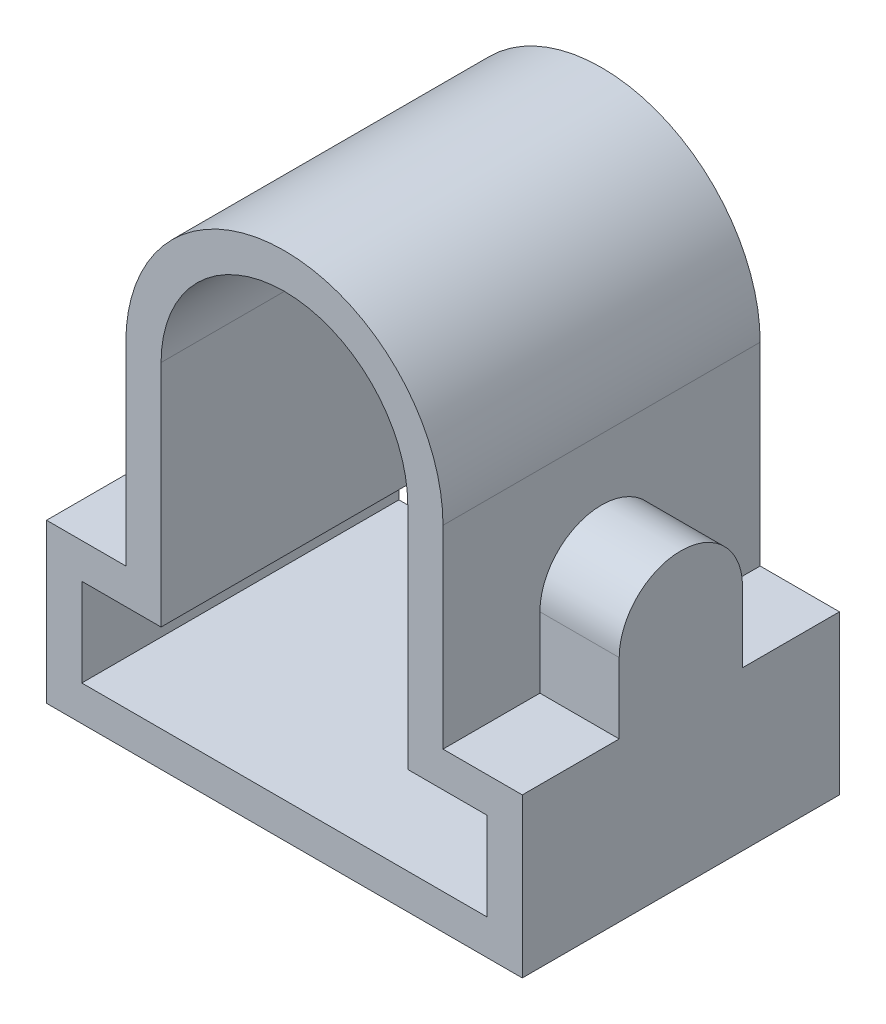
ISO-10303-21;
HEADER;
FILE_DESCRIPTION(('STEP AP214'),'2;1');
FILE_NAME('part.step','',(''),(''),'','','');
FILE_SCHEMA(('AUTOMOTIVE_DESIGN { 1 0 10303 214 1 1 1 1 }'));
ENDSEC;
DATA;
#1=APPLICATION_CONTEXT('core data for automotive mechanical design processes');
#2=APPLICATION_PROTOCOL_DEFINITION('international standard','automotive_design',2000,#1);
#3=PRODUCT_CONTEXT('',#1,'mechanical');
#4=PRODUCT('Part','Part','',(#3));
#5=PRODUCT_RELATED_PRODUCT_CATEGORY('part','',(#4));
#6=PRODUCT_DEFINITION_FORMATION('','',#4);
#7=PRODUCT_DEFINITION_CONTEXT('part definition',#1,'design');
#8=PRODUCT_DEFINITION('design','',#6,#7);
#9=PRODUCT_DEFINITION_SHAPE('','',#8);
#10=(LENGTH_UNIT() NAMED_UNIT(*) SI_UNIT(.MILLI.,.METRE.));
#11=(NAMED_UNIT(*) PLANE_ANGLE_UNIT() SI_UNIT($,.RADIAN.));
#12=(NAMED_UNIT(*) SI_UNIT($,.STERADIAN.) SOLID_ANGLE_UNIT());
#13=UNCERTAINTY_MEASURE_WITH_UNIT(LENGTH_MEASURE(1.E-05),#10,'distance_accuracy_value','');
#14=(GEOMETRIC_REPRESENTATION_CONTEXT(3) GLOBAL_UNCERTAINTY_ASSIGNED_CONTEXT((#13)) GLOBAL_UNIT_ASSIGNED_CONTEXT((#10,
#11,#12)) REPRESENTATION_CONTEXT('',''));
#15=CARTESIAN_POINT('',(0.,0.,0.));
#16=DIRECTION('',(0.,0.,1.));
#17=DIRECTION('',(1.,0.,0.));
#18=AXIS2_PLACEMENT_3D('',#15,#16,#17);
#19=CARTESIAN_POINT('',(67.5,45.,-45.));
#20=DIRECTION('',(0.,1.,0.));
#21=DIRECTION('',(0.,0.,1.));
#22=AXIS2_PLACEMENT_3D('',#19,#20,#21);
#23=PLANE('',#22);
#24=DIRECTION('',(0.,0.,1.));
#25=VECTOR('',#24,1.);
#26=CARTESIAN_POINT('',(67.5,45.,-45.));
#27=LINE('',#26,#25);
#28=CARTESIAN_POINT('',(67.5,45.,17.5));
#29=VERTEX_POINT('',#28);
#30=CARTESIAN_POINT('',(67.5,45.,45.));
#31=VERTEX_POINT('',#30);
#32=EDGE_CURVE('E318',#29,#31,#27,.T.);
#33=ORIENTED_EDGE('',*,*,#32,.F.);
#34=DIRECTION('',(-1.,0.,0.));
#35=VECTOR('',#34,1.);
#36=CARTESIAN_POINT('',(67.5,45.,17.5));
#37=LINE('',#36,#35);
#38=CARTESIAN_POINT('',(45.,45.,17.5));
#39=VERTEX_POINT('',#38);
#40=EDGE_CURVE('E190',#29,#39,#37,.T.);
#41=ORIENTED_EDGE('',*,*,#40,.T.);
#42=DIRECTION('',(0.,0.,1.));
#43=VECTOR('',#42,1.);
#44=CARTESIAN_POINT('',(45.,45.,-45.));
#45=LINE('',#44,#43);
#46=CARTESIAN_POINT('',(45.,45.,45.));
#47=VERTEX_POINT('',#46);
#48=EDGE_CURVE('E49',#39,#47,#45,.T.);
#49=ORIENTED_EDGE('',*,*,#48,.T.);
#50=DIRECTION('',(-1.,0.,0.));
#51=VECTOR('',#50,1.);
#52=CARTESIAN_POINT('',(67.5,45.,45.));
#53=LINE('',#52,#51);
#54=EDGE_CURVE('E253',#31,#47,#53,.T.);
#55=ORIENTED_EDGE('',*,*,#54,.F.);
#56=EDGE_LOOP('',(#33,#41,#49,#55));
#57=FACE_BOUND('',#56,.T.);
#58=ADVANCED_FACE('F41',(#57),#23,.T.);
#59=CARTESIAN_POINT('',(45.,45.,-45.));
#60=DIRECTION('',(1.,0.,0.));
#61=DIRECTION('',(0.,1.,0.));
#62=AXIS2_PLACEMENT_3D('',#59,#60,#61);
#63=PLANE('',#62);
#64=DIRECTION('',(0.,1.,0.));
#65=VECTOR('',#64,1.);
#66=CARTESIAN_POINT('',(45.,65.,-17.5));
#67=LINE('',#66,#65);
#68=CARTESIAN_POINT('',(45.,45.,-17.5));
#69=VERTEX_POINT('',#68);
#70=CARTESIAN_POINT('',(45.,65.,-17.5));
#71=VERTEX_POINT('',#70);
#72=EDGE_CURVE('E193',#69,#71,#67,.T.);
#73=ORIENTED_EDGE('',*,*,#72,.F.);
#74=CARTESIAN_POINT('',(45.,45.,-45.));
#75=VERTEX_POINT('',#74);
#76=EDGE_CURVE('E11',#75,#69,#45,.T.);
#77=ORIENTED_EDGE('',*,*,#76,.F.);
#78=DIRECTION('',(0.,1.,0.));
#79=VECTOR('',#78,1.);
#80=CARTESIAN_POINT('',(45.,45.,-45.));
#81=LINE('',#80,#79);
#82=CARTESIAN_POINT('',(45.,100.,-45.));
#83=VERTEX_POINT('',#82);
#84=EDGE_CURVE('E278',#75,#83,#81,.T.);
#85=ORIENTED_EDGE('',*,*,#84,.T.);
#86=DIRECTION('',(0.,0.,1.));
#87=VECTOR('',#86,1.);
#88=CARTESIAN_POINT('',(45.,100.,-45.));
#89=LINE('',#88,#87);
#90=CARTESIAN_POINT('',(45.,100.,45.));
#91=VERTEX_POINT('',#90);
#92=EDGE_CURVE('E44',#83,#91,#89,.T.);
#93=ORIENTED_EDGE('',*,*,#92,.T.);
#94=DIRECTION('',(0.,1.,0.));
#95=VECTOR('',#94,1.);
#96=CARTESIAN_POINT('',(45.,45.,45.));
#97=LINE('',#96,#95);
#98=EDGE_CURVE('E229',#47,#91,#97,.T.);
#99=ORIENTED_EDGE('',*,*,#98,.F.);
#100=ORIENTED_EDGE('',*,*,#48,.F.);
#101=DIRECTION('',(0.,-1.,0.));
#102=VECTOR('',#101,1.);
#103=CARTESIAN_POINT('',(45.,65.,17.5));
#104=LINE('',#103,#102);
#105=CARTESIAN_POINT('',(45.,65.,17.5));
#106=VERTEX_POINT('',#105);
#107=EDGE_CURVE('E341',#106,#39,#104,.T.);
#108=ORIENTED_EDGE('',*,*,#107,.F.);
#109=CARTESIAN_POINT('',(45.,65.,0.));
#110=DIRECTION('',(1.,0.,0.));
#111=DIRECTION('',(0.,1.,0.));
#112=AXIS2_PLACEMENT_3D('',#109,#110,#111);
#113=CIRCLE('',#112,17.5);
#114=EDGE_CURVE('E197',#71,#106,#113,.T.);
#115=ORIENTED_EDGE('',*,*,#114,.F.);
#116=EDGE_LOOP('',(#73,#77,#85,#93,#99,#100,#108,#115));
#117=FACE_BOUND('',#116,.T.);
#118=ADVANCED_FACE('F43',(#117),#63,.T.);
#119=DIRECTION('',(-1.,0.,0.));
#120=VECTOR('',#119,1.);
#121=CARTESIAN_POINT('',(67.5,45.,-17.5));
#122=LINE('',#121,#120);
#123=CARTESIAN_POINT('',(67.5,45.,-17.5));
#124=VERTEX_POINT('',#123);
#125=EDGE_CURVE('E208',#124,#69,#122,.T.);
#126=ORIENTED_EDGE('',*,*,#125,.F.);
#127=CARTESIAN_POINT('',(67.5,45.,-45.));
#128=VERTEX_POINT('',#127);
#129=EDGE_CURVE('E316',#128,#124,#27,.T.);
#130=ORIENTED_EDGE('',*,*,#129,.F.);
#131=DIRECTION('',(-1.,0.,0.));
#132=VECTOR('',#131,1.);
#133=CARTESIAN_POINT('',(67.5,45.,-45.));
#134=LINE('',#133,#132);
#135=EDGE_CURVE('E313',#128,#75,#134,.T.);
#136=ORIENTED_EDGE('',*,*,#135,.T.);
#137=ORIENTED_EDGE('',*,*,#76,.T.);
#138=EDGE_LOOP('',(#126,#130,#136,#137));
#139=FACE_BOUND('',#138,.T.);
#140=ADVANCED_FACE('F351',(#139),#23,.T.);
#141=CARTESIAN_POINT('',(67.5,0.,-45.));
#142=DIRECTION('',(1.,0.,0.));
#143=DIRECTION('',(0.,0.,-1.));
#144=AXIS2_PLACEMENT_3D('',#141,#142,#143);
#145=PLANE('',#144);
#146=ORIENTED_EDGE('',*,*,#129,.T.);
#147=DIRECTION('',(0.,1.,0.));
#148=VECTOR('',#147,1.);
#149=CARTESIAN_POINT('',(67.5,65.,-17.5));
#150=LINE('',#149,#148);
#151=CARTESIAN_POINT('',(67.5,65.,-17.5));
#152=VERTEX_POINT('',#151);
#153=EDGE_CURVE('E189',#124,#152,#150,.T.);
#154=ORIENTED_EDGE('',*,*,#153,.T.);
#155=CARTESIAN_POINT('',(67.5,65.,0.));
#156=DIRECTION('',(1.,0.,0.));
#157=DIRECTION('',(0.,1.,0.));
#158=AXIS2_PLACEMENT_3D('',#155,#156,#157);
#159=CIRCLE('',#158,17.5);
#160=CARTESIAN_POINT('',(67.5,65.,17.5));
#161=VERTEX_POINT('',#160);
#162=EDGE_CURVE('E192',#152,#161,#159,.T.);
#163=ORIENTED_EDGE('',*,*,#162,.T.);
#164=DIRECTION('',(0.,-1.,0.));
#165=VECTOR('',#164,1.);
#166=CARTESIAN_POINT('',(67.5,65.,17.5));
#167=LINE('',#166,#165);
#168=EDGE_CURVE('E181',#161,#29,#167,.T.);
#169=ORIENTED_EDGE('',*,*,#168,.T.);
#170=ORIENTED_EDGE('',*,*,#32,.T.);
#171=DIRECTION('',(0.,1.,0.));
#172=VECTOR('',#171,1.);
#173=CARTESIAN_POINT('',(67.5,0.,45.));
#174=LINE('',#173,#172);
#175=CARTESIAN_POINT('',(67.5,0.,45.));
#176=VERTEX_POINT('',#175);
#177=EDGE_CURVE('E246',#176,#31,#174,.T.);
#178=ORIENTED_EDGE('',*,*,#177,.F.);
#179=DIRECTION('',(0.,0.,1.));
#180=VECTOR('',#179,1.);
#181=CARTESIAN_POINT('',(67.5,0.,-45.));
#182=LINE('',#181,#180);
#183=CARTESIAN_POINT('',(67.5,0.,-45.));
#184=VERTEX_POINT('',#183);
#185=EDGE_CURVE('E317',#184,#176,#182,.T.);
#186=ORIENTED_EDGE('',*,*,#185,.F.);
#187=DIRECTION('',(0.,1.,0.));
#188=VECTOR('',#187,1.);
#189=CARTESIAN_POINT('',(67.5,0.,-45.));
#190=LINE('',#189,#188);
#191=EDGE_CURVE('E307',#184,#128,#190,.T.);
#192=ORIENTED_EDGE('',*,*,#191,.T.);
#193=EDGE_LOOP('',(#146,#154,#163,#169,#170,#178,#186,#192));
#194=FACE_BOUND('',#193,.T.);
#195=ADVANCED_FACE('F191',(#194),#145,.T.);
#196=CARTESIAN_POINT('',(-67.5,0.,-45.));
#197=DIRECTION('',(0.,-1.,0.));
#198=DIRECTION('',(1.,0.,0.));
#199=AXIS2_PLACEMENT_3D('',#196,#197,#198);
#200=PLANE('',#199);
#201=ORIENTED_EDGE('',*,*,#185,.T.);
#202=DIRECTION('',(1.,0.,0.));
#203=VECTOR('',#202,1.);
#204=CARTESIAN_POINT('',(-67.5,0.,45.));
#205=LINE('',#204,#203);
#206=CARTESIAN_POINT('',(-67.5,0.,45.));
#207=VERTEX_POINT('',#206);
#208=EDGE_CURVE('E244',#207,#176,#205,.T.);
#209=ORIENTED_EDGE('',*,*,#208,.F.);
#210=DIRECTION('',(0.,0.,1.));
#211=VECTOR('',#210,1.);
#212=CARTESIAN_POINT('',(-67.5,0.,-45.));
#213=LINE('',#212,#211);
#214=CARTESIAN_POINT('',(-67.5,0.,-45.));
#215=VERTEX_POINT('',#214);
#216=EDGE_CURVE('E321',#215,#207,#213,.T.);
#217=ORIENTED_EDGE('',*,*,#216,.F.);
#218=DIRECTION('',(1.,0.,0.));
#219=VECTOR('',#218,1.);
#220=CARTESIAN_POINT('',(-67.5,0.,-45.));
#221=LINE('',#220,#219);
#222=EDGE_CURVE('E310',#215,#184,#221,.T.);
#223=ORIENTED_EDGE('',*,*,#222,.T.);
#224=EDGE_LOOP('',(#201,#209,#217,#223));
#225=FACE_BOUND('',#224,.T.);
#226=ADVANCED_FACE('F372',(#225),#200,.T.);
#227=CARTESIAN_POINT('',(-67.5,0.,-45.));
#228=DIRECTION('',(-1.,0.,0.));
#229=DIRECTION('',(0.,0.,1.));
#230=AXIS2_PLACEMENT_3D('',#227,#228,#229);
#231=PLANE('',#230);
#232=ORIENTED_EDGE('',*,*,#216,.T.);
#233=DIRECTION('',(0.,-1.,0.));
#234=VECTOR('',#233,1.);
#235=CARTESIAN_POINT('',(-67.5,0.,45.));
#236=LINE('',#235,#234);
#237=CARTESIAN_POINT('',(-67.5,45.,45.));
#238=VERTEX_POINT('',#237);
#239=EDGE_CURVE('E245',#238,#207,#236,.T.);
#240=ORIENTED_EDGE('',*,*,#239,.F.);
#241=DIRECTION('',(0.,0.,1.));
#242=VECTOR('',#241,1.);
#243=CARTESIAN_POINT('',(-67.5,45.,-45.));
#244=LINE('',#243,#242);
#245=CARTESIAN_POINT('',(-67.5,45.,-45.));
#246=VERTEX_POINT('',#245);
#247=EDGE_CURVE('E322',#246,#238,#244,.T.);
#248=ORIENTED_EDGE('',*,*,#247,.F.);
#249=DIRECTION('',(0.,-1.,0.));
#250=VECTOR('',#249,1.);
#251=CARTESIAN_POINT('',(-67.5,0.,-45.));
#252=LINE('',#251,#250);
#253=EDGE_CURVE('E305',#246,#215,#252,.T.);
#254=ORIENTED_EDGE('',*,*,#253,.T.);
#255=EDGE_LOOP('',(#232,#240,#248,#254));
#256=FACE_BOUND('',#255,.T.);
#257=ADVANCED_FACE('F368',(#256),#231,.T.);
#258=CARTESIAN_POINT('',(-67.5,45.,-45.));
#259=DIRECTION('',(0.,1.,0.));
#260=DIRECTION('',(0.,0.,1.));
#261=AXIS2_PLACEMENT_3D('',#258,#259,#260);
#262=PLANE('',#261);
#263=ORIENTED_EDGE('',*,*,#247,.T.);
#264=DIRECTION('',(-1.,0.,0.));
#265=VECTOR('',#264,1.);
#266=CARTESIAN_POINT('',(-67.5,45.,45.));
#267=LINE('',#266,#265);
#268=CARTESIAN_POINT('',(-45.,45.,45.));
#269=VERTEX_POINT('',#268);
#270=EDGE_CURVE('E236',#269,#238,#267,.T.);
#271=ORIENTED_EDGE('',*,*,#270,.F.);
#272=DIRECTION('',(0.,0.,1.));
#273=VECTOR('',#272,1.);
#274=CARTESIAN_POINT('',(-45.,45.,-45.));
#275=LINE('',#274,#273);
#276=CARTESIAN_POINT('',(-45.,45.,-45.));
#277=VERTEX_POINT('',#276);
#278=EDGE_CURVE('E324',#277,#269,#275,.T.);
#279=ORIENTED_EDGE('',*,*,#278,.F.);
#280=DIRECTION('',(-1.,0.,0.));
#281=VECTOR('',#280,1.);
#282=CARTESIAN_POINT('',(-67.5,45.,-45.));
#283=LINE('',#282,#281);
#284=EDGE_CURVE('E303',#277,#246,#283,.T.);
#285=ORIENTED_EDGE('',*,*,#284,.T.);
#286=EDGE_LOOP('',(#263,#271,#279,#285));
#287=FACE_BOUND('',#286,.T.);
#288=ADVANCED_FACE('F370',(#287),#262,.T.);
#289=CARTESIAN_POINT('',(-45.,45.,-45.));
#290=DIRECTION('',(-1.,0.,0.));
#291=DIRECTION('',(0.,-1.,0.));
#292=AXIS2_PLACEMENT_3D('',#289,#290,#291);
#293=PLANE('',#292);
#294=ORIENTED_EDGE('',*,*,#278,.T.);
#295=DIRECTION('',(0.,-1.,0.));
#296=VECTOR('',#295,1.);
#297=CARTESIAN_POINT('',(-45.,45.,45.));
#298=LINE('',#297,#296);
#299=CARTESIAN_POINT('',(-45.,100.,45.));
#300=VERTEX_POINT('',#299);
#301=EDGE_CURVE('E237',#300,#269,#298,.T.);
#302=ORIENTED_EDGE('',*,*,#301,.F.);
#303=DIRECTION('',(0.,0.,1.));
#304=VECTOR('',#303,1.);
#305=CARTESIAN_POINT('',(-45.,100.,-45.));
#306=LINE('',#305,#304);
#307=CARTESIAN_POINT('',(-45.,100.,-45.));
#308=VERTEX_POINT('',#307);
#309=EDGE_CURVE('E327',#308,#300,#306,.T.);
#310=ORIENTED_EDGE('',*,*,#309,.F.);
#311=DIRECTION('',(0.,-1.,0.));
#312=VECTOR('',#311,1.);
#313=CARTESIAN_POINT('',(-45.,45.,-45.));
#314=LINE('',#313,#312);
#315=EDGE_CURVE('E296',#308,#277,#314,.T.);
#316=ORIENTED_EDGE('',*,*,#315,.T.);
#317=EDGE_LOOP('',(#294,#302,#310,#316));
#318=FACE_BOUND('',#317,.T.);
#319=ADVANCED_FACE('F363',(#318),#293,.T.);
#320=CARTESIAN_POINT('',(0.,100.,-45.));
#321=DIRECTION('',(0.,0.,1.));
#322=DIRECTION('',(1.,0.,0.));
#323=AXIS2_PLACEMENT_3D('',#320,#321,#322);
#324=CYLINDRICAL_SURFACE('',#323,45.);
#325=ORIENTED_EDGE('',*,*,#309,.T.);
#326=CARTESIAN_POINT('',(0.,100.,45.));
#327=DIRECTION('',(0.,0.,1.));
#328=DIRECTION('',(1.,0.,0.));
#329=AXIS2_PLACEMENT_3D('',#326,#327,#328);
#330=CIRCLE('',#329,45.);
#331=EDGE_CURVE('E232',#91,#300,#330,.T.);
#332=ORIENTED_EDGE('',*,*,#331,.F.);
#333=ORIENTED_EDGE('',*,*,#92,.F.);
#334=CARTESIAN_POINT('',(0.,100.,-45.));
#335=DIRECTION('',(0.,0.,1.));
#336=DIRECTION('',(1.,0.,0.));
#337=AXIS2_PLACEMENT_3D('',#334,#335,#336);
#338=CIRCLE('',#337,45.);
#339=EDGE_CURVE('E293',#83,#308,#338,.T.);
#340=ORIENTED_EDGE('',*,*,#339,.T.);
#341=EDGE_LOOP('',(#325,#332,#333,#340));
#342=FACE_BOUND('',#341,.T.);
#343=ADVANCED_FACE('F334',(#342),#324,.T.);
#344=CARTESIAN_POINT('',(0.,100.,-45.));
#345=DIRECTION('',(0.,0.,1.));
#346=DIRECTION('',(1.,0.,0.));
#347=AXIS2_PLACEMENT_3D('',#344,#345,#346);
#348=PLANE('',#347);
#349=DIRECTION('',(0.,1.,0.));
#350=VECTOR('',#349,1.);
#351=CARTESIAN_POINT('',(35.,35.,-45.));
#352=LINE('',#351,#350);
#353=CARTESIAN_POINT('',(35.,35.,-45.));
#354=VERTEX_POINT('',#353);
#355=CARTESIAN_POINT('',(35.,100.,-45.));
#356=VERTEX_POINT('',#355);
#357=EDGE_CURVE('E273',#354,#356,#352,.T.);
#358=ORIENTED_EDGE('',*,*,#357,.T.);
#359=CARTESIAN_POINT('',(0.,100.,-45.));
#360=DIRECTION('',(0.,0.,1.));
#361=DIRECTION('',(1.,0.,0.));
#362=AXIS2_PLACEMENT_3D('',#359,#360,#361);
#363=CIRCLE('',#362,35.);
#364=CARTESIAN_POINT('',(-35.,100.,-45.));
#365=VERTEX_POINT('',#364);
#366=EDGE_CURVE('E252',#356,#365,#363,.T.);
#367=ORIENTED_EDGE('',*,*,#366,.T.);
#368=DIRECTION('',(0.,-1.,0.));
#369=VECTOR('',#368,1.);
#370=CARTESIAN_POINT('',(-35.,35.,-45.));
#371=LINE('',#370,#369);
#372=CARTESIAN_POINT('',(-35.,35.,-45.));
#373=VERTEX_POINT('',#372);
#374=EDGE_CURVE('E257',#365,#373,#371,.T.);
#375=ORIENTED_EDGE('',*,*,#374,.T.);
#376=DIRECTION('',(-1.,0.,0.));
#377=VECTOR('',#376,1.);
#378=CARTESIAN_POINT('',(-57.5,35.,-45.));
#379=LINE('',#378,#377);
#380=CARTESIAN_POINT('',(-57.5,35.,-45.));
#381=VERTEX_POINT('',#380);
#382=EDGE_CURVE('E67',#373,#381,#379,.T.);
#383=ORIENTED_EDGE('',*,*,#382,.T.);
#384=DIRECTION('',(0.,-1.,0.));
#385=VECTOR('',#384,1.);
#386=CARTESIAN_POINT('',(-57.5,10.,-45.));
#387=LINE('',#386,#385);
#388=CARTESIAN_POINT('',(-57.5,10.,-45.));
#389=VERTEX_POINT('',#388);
#390=EDGE_CURVE('E263',#381,#389,#387,.T.);
#391=ORIENTED_EDGE('',*,*,#390,.T.);
#392=DIRECTION('',(1.,0.,0.));
#393=VECTOR('',#392,1.);
#394=CARTESIAN_POINT('',(-57.5,10.,-45.));
#395=LINE('',#394,#393);
#396=CARTESIAN_POINT('',(57.5,10.,-45.));
#397=VERTEX_POINT('',#396);
#398=EDGE_CURVE('E264',#389,#397,#395,.T.);
#399=ORIENTED_EDGE('',*,*,#398,.T.);
#400=DIRECTION('',(0.,1.,0.));
#401=VECTOR('',#400,1.);
#402=CARTESIAN_POINT('',(57.5,10.,-45.));
#403=LINE('',#402,#401);
#404=CARTESIAN_POINT('',(57.5,35.,-45.));
#405=VERTEX_POINT('',#404);
#406=EDGE_CURVE('E270',#397,#405,#403,.T.);
#407=ORIENTED_EDGE('',*,*,#406,.T.);
#408=DIRECTION('',(-1.,0.,0.));
#409=VECTOR('',#408,1.);
#410=CARTESIAN_POINT('',(57.5,35.,-45.));
#411=LINE('',#410,#409);
#412=EDGE_CURVE('E269',#405,#354,#411,.T.);
#413=ORIENTED_EDGE('',*,*,#412,.T.);
#414=EDGE_LOOP('',(#358,#367,#375,#383,#391,#399,#407,#413));
#415=FACE_BOUND('',#414,.T.);
#416=ORIENTED_EDGE('',*,*,#84,.F.);
#417=ORIENTED_EDGE('',*,*,#135,.F.);
#418=ORIENTED_EDGE('',*,*,#191,.F.);
#419=ORIENTED_EDGE('',*,*,#222,.F.);
#420=ORIENTED_EDGE('',*,*,#253,.F.);
#421=ORIENTED_EDGE('',*,*,#284,.F.);
#422=ORIENTED_EDGE('',*,*,#315,.F.);
#423=ORIENTED_EDGE('',*,*,#339,.F.);
#424=EDGE_LOOP('',(#416,#417,#418,#419,#420,#421,#422,#423));
#425=FACE_BOUND('',#424,.T.);
#426=ADVANCED_FACE('F360',(#415,#425),#348,.F.);
#427=CARTESIAN_POINT('',(0.,100.,-45.));
#428=DIRECTION('',(0.,0.,1.));
#429=DIRECTION('',(1.,0.,0.));
#430=AXIS2_PLACEMENT_3D('',#427,#428,#429);
#431=CYLINDRICAL_SURFACE('',#430,35.);
#432=DIRECTION('',(0.,0.,1.));
#433=VECTOR('',#432,1.);
#434=CARTESIAN_POINT('',(35.,100.,-45.));
#435=LINE('',#434,#433);
#436=CARTESIAN_POINT('',(35.,100.,45.));
#437=VERTEX_POINT('',#436);
#438=EDGE_CURVE('E280',#356,#437,#435,.T.);
#439=ORIENTED_EDGE('',*,*,#438,.T.);
#440=CARTESIAN_POINT('',(0.,100.,45.));
#441=DIRECTION('',(0.,0.,1.));
#442=DIRECTION('',(1.,0.,0.));
#443=AXIS2_PLACEMENT_3D('',#440,#441,#442);
#444=CIRCLE('',#443,35.);
#445=CARTESIAN_POINT('',(-35.,100.,45.));
#446=VERTEX_POINT('',#445);
#447=EDGE_CURVE('E202',#437,#446,#444,.T.);
#448=ORIENTED_EDGE('',*,*,#447,.T.);
#449=DIRECTION('',(0.,0.,1.));
#450=VECTOR('',#449,1.);
#451=CARTESIAN_POINT('',(-35.,100.,-45.));
#452=LINE('',#451,#450);
#453=EDGE_CURVE('E276',#365,#446,#452,.T.);
#454=ORIENTED_EDGE('',*,*,#453,.F.);
#455=ORIENTED_EDGE('',*,*,#366,.F.);
#456=EDGE_LOOP('',(#439,#448,#454,#455));
#457=FACE_BOUND('',#456,.T.);
#458=ADVANCED_FACE('F498',(#457),#431,.F.);
#459=CARTESIAN_POINT('',(35.,35.,-45.));
#460=DIRECTION('',(1.,0.,0.));
#461=DIRECTION('',(0.,1.,0.));
#462=AXIS2_PLACEMENT_3D('',#459,#460,#461);
#463=PLANE('',#462);
#464=DIRECTION('',(0.,0.,1.));
#465=VECTOR('',#464,1.);
#466=CARTESIAN_POINT('',(35.,35.,-45.));
#467=LINE('',#466,#465);
#468=CARTESIAN_POINT('',(35.,35.,45.));
#469=VERTEX_POINT('',#468);
#470=EDGE_CURVE('E279',#354,#469,#467,.T.);
#471=ORIENTED_EDGE('',*,*,#470,.T.);
#472=DIRECTION('',(0.,1.,0.));
#473=VECTOR('',#472,1.);
#474=CARTESIAN_POINT('',(35.,35.,45.));
#475=LINE('',#474,#473);
#476=EDGE_CURVE('E230',#469,#437,#475,.T.);
#477=ORIENTED_EDGE('',*,*,#476,.T.);
#478=ORIENTED_EDGE('',*,*,#438,.F.);
#479=ORIENTED_EDGE('',*,*,#357,.F.);
#480=EDGE_LOOP('',(#471,#477,#478,#479));
#481=FACE_BOUND('',#480,.T.);
#482=ADVANCED_FACE('F489',(#481),#463,.F.);
#483=CARTESIAN_POINT('',(57.5,35.,-45.));
#484=DIRECTION('',(0.,1.,0.));
#485=DIRECTION('',(0.,0.,1.));
#486=AXIS2_PLACEMENT_3D('',#483,#484,#485);
#487=PLANE('',#486);
#488=DIRECTION('',(0.,0.,1.));
#489=VECTOR('',#488,1.);
#490=CARTESIAN_POINT('',(57.5,35.,-45.));
#491=LINE('',#490,#489);
#492=CARTESIAN_POINT('',(57.5,35.,45.));
#493=VERTEX_POINT('',#492);
#494=EDGE_CURVE('E285',#405,#493,#491,.T.);
#495=ORIENTED_EDGE('',*,*,#494,.T.);
#496=DIRECTION('',(-1.,0.,0.));
#497=VECTOR('',#496,1.);
#498=CARTESIAN_POINT('',(57.5,35.,45.));
#499=LINE('',#498,#497);
#500=EDGE_CURVE('E222',#493,#469,#499,.T.);
#501=ORIENTED_EDGE('',*,*,#500,.T.);
#502=ORIENTED_EDGE('',*,*,#470,.F.);
#503=ORIENTED_EDGE('',*,*,#412,.F.);
#504=EDGE_LOOP('',(#495,#501,#502,#503));
#505=FACE_BOUND('',#504,.T.);
#506=ADVANCED_FACE('F479',(#505),#487,.F.);
#507=CARTESIAN_POINT('',(57.5,10.,-45.));
#508=DIRECTION('',(1.,0.,0.));
#509=DIRECTION('',(0.,0.,-1.));
#510=AXIS2_PLACEMENT_3D('',#507,#508,#509);
#511=PLANE('',#510);
#512=DIRECTION('',(0.,0.,1.));
#513=VECTOR('',#512,1.);
#514=CARTESIAN_POINT('',(57.5,10.,-45.));
#515=LINE('',#514,#513);
#516=CARTESIAN_POINT('',(57.5,10.,45.));
#517=VERTEX_POINT('',#516);
#518=EDGE_CURVE('E281',#397,#517,#515,.T.);
#519=ORIENTED_EDGE('',*,*,#518,.T.);
#520=DIRECTION('',(0.,1.,0.));
#521=VECTOR('',#520,1.);
#522=CARTESIAN_POINT('',(57.5,10.,45.));
#523=LINE('',#522,#521);
#524=EDGE_CURVE('E221',#517,#493,#523,.T.);
#525=ORIENTED_EDGE('',*,*,#524,.T.);
#526=ORIENTED_EDGE('',*,*,#494,.F.);
#527=ORIENTED_EDGE('',*,*,#406,.F.);
#528=EDGE_LOOP('',(#519,#525,#526,#527));
#529=FACE_BOUND('',#528,.T.);
#530=ADVANCED_FACE('F472',(#529),#511,.F.);
#531=CARTESIAN_POINT('',(-57.5,10.,-45.));
#532=DIRECTION('',(0.,-1.,0.));
#533=DIRECTION('',(0.,0.,-1.));
#534=AXIS2_PLACEMENT_3D('',#531,#532,#533);
#535=PLANE('',#534);
#536=DIRECTION('',(0.,0.,1.));
#537=VECTOR('',#536,1.);
#538=CARTESIAN_POINT('',(-57.5,10.,-45.));
#539=LINE('',#538,#537);
#540=CARTESIAN_POINT('',(-57.5,10.,45.));
#541=VERTEX_POINT('',#540);
#542=EDGE_CURVE('E288',#389,#541,#539,.T.);
#543=ORIENTED_EDGE('',*,*,#542,.T.);
#544=DIRECTION('',(1.,0.,0.));
#545=VECTOR('',#544,1.);
#546=CARTESIAN_POINT('',(-57.5,10.,45.));
#547=LINE('',#546,#545);
#548=EDGE_CURVE('E216',#541,#517,#547,.T.);
#549=ORIENTED_EDGE('',*,*,#548,.T.);
#550=ORIENTED_EDGE('',*,*,#518,.F.);
#551=ORIENTED_EDGE('',*,*,#398,.F.);
#552=EDGE_LOOP('',(#543,#549,#550,#551));
#553=FACE_BOUND('',#552,.T.);
#554=ADVANCED_FACE('F465',(#553),#535,.F.);
#555=CARTESIAN_POINT('',(-57.5,10.,-45.));
#556=DIRECTION('',(-1.,0.,0.));
#557=DIRECTION('',(0.,0.,1.));
#558=AXIS2_PLACEMENT_3D('',#555,#556,#557);
#559=PLANE('',#558);
#560=DIRECTION('',(0.,0.,1.));
#561=VECTOR('',#560,1.);
#562=CARTESIAN_POINT('',(-57.5,35.,-45.));
#563=LINE('',#562,#561);
#564=CARTESIAN_POINT('',(-57.5,35.,45.));
#565=VERTEX_POINT('',#564);
#566=EDGE_CURVE('E286',#381,#565,#563,.T.);
#567=ORIENTED_EDGE('',*,*,#566,.T.);
#568=DIRECTION('',(0.,-1.,0.));
#569=VECTOR('',#568,1.);
#570=CARTESIAN_POINT('',(-57.5,10.,45.));
#571=LINE('',#570,#569);
#572=EDGE_CURVE('E214',#565,#541,#571,.T.);
#573=ORIENTED_EDGE('',*,*,#572,.T.);
#574=ORIENTED_EDGE('',*,*,#542,.F.);
#575=ORIENTED_EDGE('',*,*,#390,.F.);
#576=EDGE_LOOP('',(#567,#573,#574,#575));
#577=FACE_BOUND('',#576,.T.);
#578=ADVANCED_FACE('F452',(#577),#559,.F.);
#579=CARTESIAN_POINT('',(-57.5,35.,-45.));
#580=DIRECTION('',(0.,1.,0.));
#581=DIRECTION('',(0.,0.,1.));
#582=AXIS2_PLACEMENT_3D('',#579,#580,#581);
#583=PLANE('',#582);
#584=DIRECTION('',(0.,0.,1.));
#585=VECTOR('',#584,1.);
#586=CARTESIAN_POINT('',(-35.,35.,-45.));
#587=LINE('',#586,#585);
#588=CARTESIAN_POINT('',(-35.,35.,45.));
#589=VERTEX_POINT('',#588);
#590=EDGE_CURVE('E289',#373,#589,#587,.T.);
#591=ORIENTED_EDGE('',*,*,#590,.T.);
#592=DIRECTION('',(-1.,0.,0.));
#593=VECTOR('',#592,1.);
#594=CARTESIAN_POINT('',(-57.5,35.,45.));
#595=LINE('',#594,#593);
#596=EDGE_CURVE('E212',#589,#565,#595,.T.);
#597=ORIENTED_EDGE('',*,*,#596,.T.);
#598=ORIENTED_EDGE('',*,*,#566,.F.);
#599=ORIENTED_EDGE('',*,*,#382,.F.);
#600=EDGE_LOOP('',(#591,#597,#598,#599));
#601=FACE_BOUND('',#600,.T.);
#602=ADVANCED_FACE('F442',(#601),#583,.F.);
#603=CARTESIAN_POINT('',(-35.,35.,-45.));
#604=DIRECTION('',(-1.,0.,0.));
#605=DIRECTION('',(0.,-1.,0.));
#606=AXIS2_PLACEMENT_3D('',#603,#604,#605);
#607=PLANE('',#606);
#608=ORIENTED_EDGE('',*,*,#453,.T.);
#609=DIRECTION('',(0.,-1.,0.));
#610=VECTOR('',#609,1.);
#611=CARTESIAN_POINT('',(-35.,35.,45.));
#612=LINE('',#611,#610);
#613=EDGE_CURVE('E204',#446,#589,#612,.T.);
#614=ORIENTED_EDGE('',*,*,#613,.T.);
#615=ORIENTED_EDGE('',*,*,#590,.F.);
#616=ORIENTED_EDGE('',*,*,#374,.F.);
#617=EDGE_LOOP('',(#608,#614,#615,#616));
#618=FACE_BOUND('',#617,.T.);
#619=ADVANCED_FACE('F437',(#618),#607,.F.);
#620=CARTESIAN_POINT('',(0.,100.,45.));
#621=DIRECTION('',(0.,0.,1.));
#622=DIRECTION('',(1.,0.,0.));
#623=AXIS2_PLACEMENT_3D('',#620,#621,#622);
#624=PLANE('',#623);
#625=ORIENTED_EDGE('',*,*,#98,.T.);
#626=ORIENTED_EDGE('',*,*,#331,.T.);
#627=ORIENTED_EDGE('',*,*,#301,.T.);
#628=ORIENTED_EDGE('',*,*,#270,.T.);
#629=ORIENTED_EDGE('',*,*,#239,.T.);
#630=ORIENTED_EDGE('',*,*,#208,.T.);
#631=ORIENTED_EDGE('',*,*,#177,.T.);
#632=ORIENTED_EDGE('',*,*,#54,.T.);
#633=EDGE_LOOP('',(#625,#626,#627,#628,#629,#630,#631,#632));
#634=FACE_BOUND('',#633,.T.);
#635=ORIENTED_EDGE('',*,*,#613,.F.);
#636=ORIENTED_EDGE('',*,*,#447,.F.);
#637=ORIENTED_EDGE('',*,*,#476,.F.);
#638=ORIENTED_EDGE('',*,*,#500,.F.);
#639=ORIENTED_EDGE('',*,*,#524,.F.);
#640=ORIENTED_EDGE('',*,*,#548,.F.);
#641=ORIENTED_EDGE('',*,*,#572,.F.);
#642=ORIENTED_EDGE('',*,*,#596,.F.);
#643=EDGE_LOOP('',(#635,#636,#637,#638,#639,#640,#641,#642));
#644=FACE_BOUND('',#643,.T.);
#645=ADVANCED_FACE('F336',(#634,#644),#624,.T.);
#646=CARTESIAN_POINT('',(67.5,65.,0.));
#647=DIRECTION('',(-1.,0.,0.));
#648=DIRECTION('',(0.,-1.,0.));
#649=AXIS2_PLACEMENT_3D('',#646,#647,#648);
#650=CYLINDRICAL_SURFACE('',#649,17.5);
#651=ORIENTED_EDGE('',*,*,#114,.T.);
#652=DIRECTION('',(-1.,0.,0.));
#653=VECTOR('',#652,1.);
#654=CARTESIAN_POINT('',(67.5,65.,17.5));
#655=LINE('',#654,#653);
#656=EDGE_CURVE('E184',#161,#106,#655,.T.);
#657=ORIENTED_EDGE('',*,*,#656,.F.);
#658=ORIENTED_EDGE('',*,*,#162,.F.);
#659=DIRECTION('',(-1.,0.,0.));
#660=VECTOR('',#659,1.);
#661=CARTESIAN_POINT('',(67.5,65.,-17.5));
#662=LINE('',#661,#660);
#663=EDGE_CURVE('E59',#152,#71,#662,.T.);
#664=ORIENTED_EDGE('',*,*,#663,.T.);
#665=EDGE_LOOP('',(#651,#657,#658,#664));
#666=FACE_BOUND('',#665,.T.);
#667=ADVANCED_FACE('F200',(#666),#650,.T.);
#668=CARTESIAN_POINT('',(67.5,65.,17.5));
#669=DIRECTION('',(0.,0.,-1.));
#670=DIRECTION('',(0.,1.,0.));
#671=AXIS2_PLACEMENT_3D('',#668,#669,#670);
#672=PLANE('',#671);
#673=ORIENTED_EDGE('',*,*,#107,.T.);
#674=ORIENTED_EDGE('',*,*,#40,.F.);
#675=ORIENTED_EDGE('',*,*,#168,.F.);
#676=ORIENTED_EDGE('',*,*,#656,.T.);
#677=EDGE_LOOP('',(#673,#674,#675,#676));
#678=FACE_BOUND('',#677,.T.);
#679=ADVANCED_FACE('F183',(#678),#672,.F.);
#680=CARTESIAN_POINT('',(67.5,65.,-17.5));
#681=DIRECTION('',(0.,0.,1.));
#682=DIRECTION('',(0.,-1.,0.));
#683=AXIS2_PLACEMENT_3D('',#680,#681,#682);
#684=PLANE('',#683);
#685=ORIENTED_EDGE('',*,*,#72,.T.);
#686=ORIENTED_EDGE('',*,*,#663,.F.);
#687=ORIENTED_EDGE('',*,*,#153,.F.);
#688=ORIENTED_EDGE('',*,*,#125,.T.);
#689=EDGE_LOOP('',(#685,#686,#687,#688));
#690=FACE_BOUND('',#689,.T.);
#691=ADVANCED_FACE('F353',(#690),#684,.F.);
#692=CLOSED_SHELL('',(#58,#118,#140,#195,#226,#257,#288,#319,#343,#426,#458,#482,#506,#530,#554,
#578,#602,#619,#645,#667,#679,#691));
#693=MANIFOLD_SOLID_BREP('B2',#692);
#694=ADVANCED_BREP_SHAPE_REPRESENTATION('',(#18,#693),#14);
#695=SHAPE_DEFINITION_REPRESENTATION(#9,#694);
ENDSEC;
END-ISO-10303-21;
